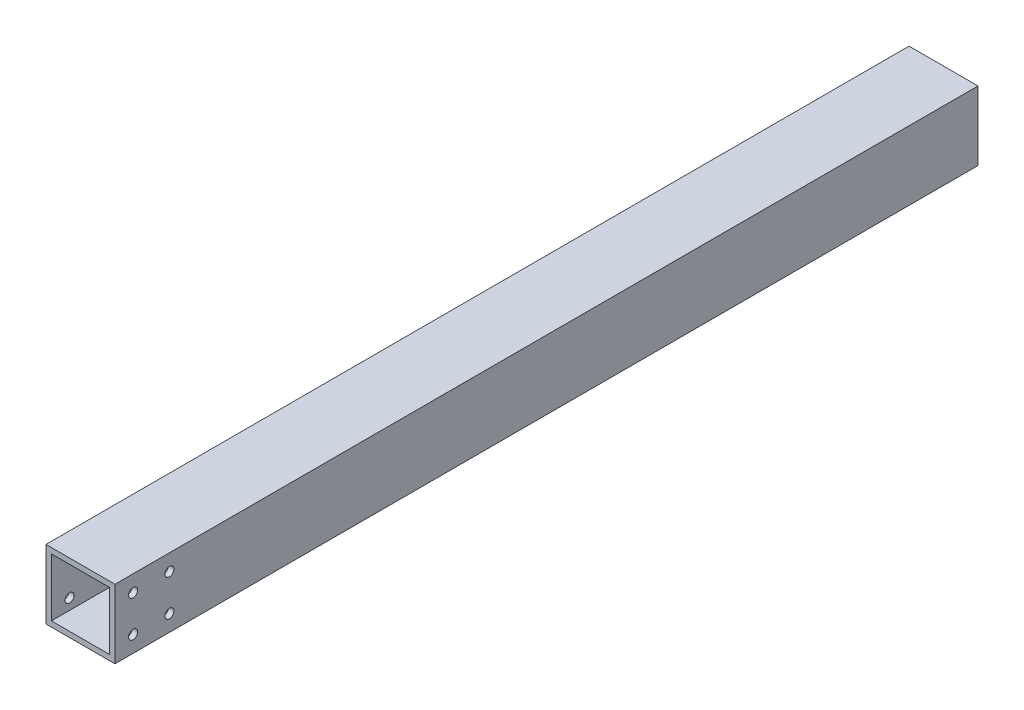
ISO-10303-21;
HEADER;
FILE_DESCRIPTION(('STEP AP214'),'2;1');
FILE_NAME('part.step','',(''),(''),'','','');
FILE_SCHEMA(('AUTOMOTIVE_DESIGN { 1 0 10303 214 1 1 1 1 }'));
ENDSEC;
DATA;
#1=APPLICATION_CONTEXT('core data for automotive mechanical design processes');
#2=APPLICATION_PROTOCOL_DEFINITION('international standard','automotive_design',2000,#1);
#3=PRODUCT_CONTEXT('',#1,'mechanical');
#4=PRODUCT('Part','Part','',(#3));
#5=PRODUCT_RELATED_PRODUCT_CATEGORY('part','',(#4));
#6=PRODUCT_DEFINITION_FORMATION('','',#4);
#7=PRODUCT_DEFINITION_CONTEXT('part definition',#1,'design');
#8=PRODUCT_DEFINITION('design','',#6,#7);
#9=PRODUCT_DEFINITION_SHAPE('','',#8);
#10=(LENGTH_UNIT() NAMED_UNIT(*) SI_UNIT(.MILLI.,.METRE.));
#11=(NAMED_UNIT(*) PLANE_ANGLE_UNIT() SI_UNIT($,.RADIAN.));
#12=(NAMED_UNIT(*) SI_UNIT($,.STERADIAN.) SOLID_ANGLE_UNIT());
#13=UNCERTAINTY_MEASURE_WITH_UNIT(LENGTH_MEASURE(1.E-05),#10,'distance_accuracy_value','');
#14=(GEOMETRIC_REPRESENTATION_CONTEXT(3) GLOBAL_UNCERTAINTY_ASSIGNED_CONTEXT((#13)) GLOBAL_UNIT_ASSIGNED_CONTEXT((#10,
#11,#12)) REPRESENTATION_CONTEXT('',''));
#15=CARTESIAN_POINT('',(0.,0.,0.));
#16=DIRECTION('',(0.,0.,1.));
#17=DIRECTION('',(1.,0.,0.));
#18=AXIS2_PLACEMENT_3D('',#15,#16,#17);
#19=CARTESIAN_POINT('',(0.,0.,475.6));
#20=DIRECTION('',(0.,0.,-1.));
#21=DIRECTION('',(-1.,0.,0.));
#22=AXIS2_PLACEMENT_3D('',#19,#20,#21);
#23=PLANE('',#22);
#24=DIRECTION('',(0.,1.,0.));
#25=VECTOR('',#24,1.);
#26=CARTESIAN_POINT('',(19.,-19.,475.6));
#27=LINE('',#26,#25);
#28=CARTESIAN_POINT('',(19.,-19.,475.6));
#29=VERTEX_POINT('',#28);
#30=CARTESIAN_POINT('',(19.,19.,475.6));
#31=VERTEX_POINT('',#30);
#32=EDGE_CURVE('E148',#29,#31,#27,.T.);
#33=ORIENTED_EDGE('',*,*,#32,.T.);
#34=DIRECTION('',(-1.,0.,0.));
#35=VECTOR('',#34,1.);
#36=CARTESIAN_POINT('',(-19.,19.,475.6));
#37=LINE('',#36,#35);
#38=CARTESIAN_POINT('',(-19.,19.,475.6));
#39=VERTEX_POINT('',#38);
#40=EDGE_CURVE('E151',#31,#39,#37,.T.);
#41=ORIENTED_EDGE('',*,*,#40,.T.);
#42=DIRECTION('',(0.,-1.,0.));
#43=VECTOR('',#42,1.);
#44=CARTESIAN_POINT('',(-19.,-19.,475.6));
#45=LINE('',#44,#43);
#46=CARTESIAN_POINT('',(-19.,-19.,475.6));
#47=VERTEX_POINT('',#46);
#48=EDGE_CURVE('E154',#39,#47,#45,.T.);
#49=ORIENTED_EDGE('',*,*,#48,.T.);
#50=DIRECTION('',(1.,0.,0.));
#51=VECTOR('',#50,1.);
#52=CARTESIAN_POINT('',(-19.,-19.,475.6));
#53=LINE('',#52,#51);
#54=EDGE_CURVE('E156',#47,#29,#53,.T.);
#55=ORIENTED_EDGE('',*,*,#54,.T.);
#56=EDGE_LOOP('',(#33,#41,#49,#55));
#57=FACE_BOUND('',#56,.T.);
#58=DIRECTION('',(0.,-1.,0.));
#59=VECTOR('',#58,1.);
#60=CARTESIAN_POINT('',(-16.,-16.,475.6));
#61=LINE('',#60,#59);
#62=CARTESIAN_POINT('',(-16.,16.,475.6));
#63=VERTEX_POINT('',#62);
#64=CARTESIAN_POINT('',(-16.,-16.,475.6));
#65=VERTEX_POINT('',#64);
#66=EDGE_CURVE('E110',#63,#65,#61,.T.);
#67=ORIENTED_EDGE('',*,*,#66,.F.);
#68=DIRECTION('',(-1.,0.,0.));
#69=VECTOR('',#68,1.);
#70=CARTESIAN_POINT('',(-16.,16.,475.6));
#71=LINE('',#70,#69);
#72=CARTESIAN_POINT('',(16.,16.,475.6));
#73=VERTEX_POINT('',#72);
#74=EDGE_CURVE('E132',#73,#63,#71,.T.);
#75=ORIENTED_EDGE('',*,*,#74,.F.);
#76=DIRECTION('',(0.,1.,0.));
#77=VECTOR('',#76,1.);
#78=CARTESIAN_POINT('',(16.,-16.,475.6));
#79=LINE('',#78,#77);
#80=CARTESIAN_POINT('',(16.,-16.,475.6));
#81=VERTEX_POINT('',#80);
#82=EDGE_CURVE('E130',#81,#73,#79,.T.);
#83=ORIENTED_EDGE('',*,*,#82,.F.);
#84=DIRECTION('',(1.,0.,0.));
#85=VECTOR('',#84,1.);
#86=CARTESIAN_POINT('',(-16.,-16.,475.6));
#87=LINE('',#86,#85);
#88=EDGE_CURVE('E118',#65,#81,#87,.T.);
#89=ORIENTED_EDGE('',*,*,#88,.F.);
#90=EDGE_LOOP('',(#67,#75,#83,#89));
#91=FACE_BOUND('',#90,.T.);
#92=ADVANCED_FACE('F43',(#57,#91),#23,.F.);
#93=CARTESIAN_POINT('',(0.,0.,0.));
#94=DIRECTION('',(0.,0.,-1.));
#95=DIRECTION('',(-1.,0.,0.));
#96=AXIS2_PLACEMENT_3D('',#93,#94,#95);
#97=PLANE('',#96);
#98=DIRECTION('',(0.,1.,0.));
#99=VECTOR('',#98,1.);
#100=CARTESIAN_POINT('',(19.,-19.,0.));
#101=LINE('',#100,#99);
#102=CARTESIAN_POINT('',(19.,-19.,0.));
#103=VERTEX_POINT('',#102);
#104=CARTESIAN_POINT('',(19.,19.,0.));
#105=VERTEX_POINT('',#104);
#106=EDGE_CURVE('E126',#103,#105,#101,.T.);
#107=ORIENTED_EDGE('',*,*,#106,.F.);
#108=DIRECTION('',(1.,0.,0.));
#109=VECTOR('',#108,1.);
#110=CARTESIAN_POINT('',(-19.,-19.,0.));
#111=LINE('',#110,#109);
#112=CARTESIAN_POINT('',(-19.,-19.,0.));
#113=VERTEX_POINT('',#112);
#114=EDGE_CURVE('E152',#113,#103,#111,.T.);
#115=ORIENTED_EDGE('',*,*,#114,.F.);
#116=DIRECTION('',(0.,-1.,0.));
#117=VECTOR('',#116,1.);
#118=CARTESIAN_POINT('',(-19.,-19.,0.));
#119=LINE('',#118,#117);
#120=CARTESIAN_POINT('',(-19.,19.,0.));
#121=VERTEX_POINT('',#120);
#122=EDGE_CURVE('E163',#121,#113,#119,.T.);
#123=ORIENTED_EDGE('',*,*,#122,.F.);
#124=DIRECTION('',(-1.,0.,0.));
#125=VECTOR('',#124,1.);
#126=CARTESIAN_POINT('',(-19.,19.,0.));
#127=LINE('',#126,#125);
#128=EDGE_CURVE('E161',#105,#121,#127,.T.);
#129=ORIENTED_EDGE('',*,*,#128,.F.);
#130=EDGE_LOOP('',(#107,#115,#123,#129));
#131=FACE_BOUND('',#130,.T.);
#132=DIRECTION('',(-1.,0.,0.));
#133=VECTOR('',#132,1.);
#134=CARTESIAN_POINT('',(-16.,16.,0.));
#135=LINE('',#134,#133);
#136=CARTESIAN_POINT('',(16.,16.,0.));
#137=VERTEX_POINT('',#136);
#138=CARTESIAN_POINT('',(-16.,16.,0.));
#139=VERTEX_POINT('',#138);
#140=EDGE_CURVE('E119',#137,#139,#135,.T.);
#141=ORIENTED_EDGE('',*,*,#140,.T.);
#142=DIRECTION('',(0.,-1.,0.));
#143=VECTOR('',#142,1.);
#144=CARTESIAN_POINT('',(-16.,-16.,0.));
#145=LINE('',#144,#143);
#146=CARTESIAN_POINT('',(-16.,-16.,0.));
#147=VERTEX_POINT('',#146);
#148=EDGE_CURVE('E68',#139,#147,#145,.T.);
#149=ORIENTED_EDGE('',*,*,#148,.T.);
#150=DIRECTION('',(1.,0.,0.));
#151=VECTOR('',#150,1.);
#152=CARTESIAN_POINT('',(-16.,-16.,0.));
#153=LINE('',#152,#151);
#154=CARTESIAN_POINT('',(16.,-16.,0.));
#155=VERTEX_POINT('',#154);
#156=EDGE_CURVE('E125',#147,#155,#153,.T.);
#157=ORIENTED_EDGE('',*,*,#156,.T.);
#158=DIRECTION('',(0.,1.,0.));
#159=VECTOR('',#158,1.);
#160=CARTESIAN_POINT('',(16.,-16.,0.));
#161=LINE('',#160,#159);
#162=EDGE_CURVE('E140',#155,#137,#161,.T.);
#163=ORIENTED_EDGE('',*,*,#162,.T.);
#164=EDGE_LOOP('',(#141,#149,#157,#163));
#165=FACE_BOUND('',#164,.T.);
#166=ADVANCED_FACE('F232',(#131,#165),#97,.T.);
#167=CARTESIAN_POINT('',(19.,-19.,475.6));
#168=DIRECTION('',(-1.,0.,0.));
#169=DIRECTION('',(0.,0.,1.));
#170=AXIS2_PLACEMENT_3D('',#167,#168,#169);
#171=PLANE('',#170);
#172=CARTESIAN_POINT('',(19.,10.,445.6));
#173=DIRECTION('',(-1.,0.,0.));
#174=DIRECTION('',(0.,0.,1.));
#175=AXIS2_PLACEMENT_3D('',#172,#173,#174);
#176=CIRCLE('',#175,2.50000000000002);
#177=CARTESIAN_POINT('',(19.,10.,448.1));
#178=VERTEX_POINT('',#177);
#179=EDGE_CURVE('E204',#178,#178,#176,.T.);
#180=ORIENTED_EDGE('',*,*,#179,.T.);
#181=EDGE_LOOP('',(#180));
#182=FACE_BOUND('',#181,.T.);
#183=CARTESIAN_POINT('',(19.,-10.,445.6));
#184=DIRECTION('',(-1.,0.,0.));
#185=DIRECTION('',(0.,0.,1.));
#186=AXIS2_PLACEMENT_3D('',#183,#184,#185);
#187=CIRCLE('',#186,2.50000000000002);
#188=CARTESIAN_POINT('',(19.,-10.,448.1));
#189=VERTEX_POINT('',#188);
#190=EDGE_CURVE('E189',#189,#189,#187,.T.);
#191=ORIENTED_EDGE('',*,*,#190,.T.);
#192=EDGE_LOOP('',(#191));
#193=FACE_BOUND('',#192,.T.);
#194=CARTESIAN_POINT('',(19.,-9.99999999999999,465.6));
#195=DIRECTION('',(-1.,0.,0.));
#196=DIRECTION('',(0.,0.,1.));
#197=AXIS2_PLACEMENT_3D('',#194,#195,#196);
#198=CIRCLE('',#197,2.49999999999991);
#199=CARTESIAN_POINT('',(19.,-9.99999999999999,468.1));
#200=VERTEX_POINT('',#199);
#201=EDGE_CURVE('E185',#200,#200,#198,.T.);
#202=ORIENTED_EDGE('',*,*,#201,.T.);
#203=EDGE_LOOP('',(#202));
#204=FACE_BOUND('',#203,.T.);
#205=CARTESIAN_POINT('',(19.,10.,465.6));
#206=DIRECTION('',(-1.,0.,0.));
#207=DIRECTION('',(0.,0.,1.));
#208=AXIS2_PLACEMENT_3D('',#205,#206,#207);
#209=CIRCLE('',#208,2.49999999999991);
#210=CARTESIAN_POINT('',(19.,10.,468.1));
#211=VERTEX_POINT('',#210);
#212=EDGE_CURVE('E138',#211,#211,#209,.T.);
#213=ORIENTED_EDGE('',*,*,#212,.T.);
#214=EDGE_LOOP('',(#213));
#215=FACE_BOUND('',#214,.T.);
#216=ORIENTED_EDGE('',*,*,#106,.T.);
#217=DIRECTION('',(0.,0.,-1.));
#218=VECTOR('',#217,1.);
#219=CARTESIAN_POINT('',(19.,19.,475.6));
#220=LINE('',#219,#218);
#221=EDGE_CURVE('E11',#31,#105,#220,.T.);
#222=ORIENTED_EDGE('',*,*,#221,.F.);
#223=ORIENTED_EDGE('',*,*,#32,.F.);
#224=DIRECTION('',(0.,0.,-1.));
#225=VECTOR('',#224,1.);
#226=CARTESIAN_POINT('',(19.,-19.,475.6));
#227=LINE('',#226,#225);
#228=EDGE_CURVE('E158',#29,#103,#227,.T.);
#229=ORIENTED_EDGE('',*,*,#228,.T.);
#230=EDGE_LOOP('',(#216,#222,#223,#229));
#231=FACE_BOUND('',#230,.T.);
#232=ADVANCED_FACE('F45',(#182,#193,#204,#215,#231),#171,.F.);
#233=CARTESIAN_POINT('',(-19.,19.,475.6));
#234=DIRECTION('',(0.,-1.,0.));
#235=DIRECTION('',(1.,0.,0.));
#236=AXIS2_PLACEMENT_3D('',#233,#234,#235);
#237=PLANE('',#236);
#238=ORIENTED_EDGE('',*,*,#128,.T.);
#239=DIRECTION('',(0.,0.,-1.));
#240=VECTOR('',#239,1.);
#241=CARTESIAN_POINT('',(-19.,19.,475.6));
#242=LINE('',#241,#240);
#243=EDGE_CURVE('E52',#39,#121,#242,.T.);
#244=ORIENTED_EDGE('',*,*,#243,.F.);
#245=ORIENTED_EDGE('',*,*,#40,.F.);
#246=ORIENTED_EDGE('',*,*,#221,.T.);
#247=EDGE_LOOP('',(#238,#244,#245,#246));
#248=FACE_BOUND('',#247,.T.);
#249=ADVANCED_FACE('F249',(#248),#237,.F.);
#250=CARTESIAN_POINT('',(-19.,-19.,475.6));
#251=DIRECTION('',(1.,0.,0.));
#252=DIRECTION('',(0.,0.,-1.));
#253=AXIS2_PLACEMENT_3D('',#250,#251,#252);
#254=PLANE('',#253);
#255=CARTESIAN_POINT('',(-19.,10.,445.6));
#256=DIRECTION('',(1.,0.,0.));
#257=DIRECTION('',(0.,0.,-1.));
#258=AXIS2_PLACEMENT_3D('',#255,#256,#257);
#259=CIRCLE('',#258,2.50000000000002);
#260=CARTESIAN_POINT('',(-19.,10.,443.1));
#261=VERTEX_POINT('',#260);
#262=EDGE_CURVE('E181',#261,#261,#259,.T.);
#263=ORIENTED_EDGE('',*,*,#262,.T.);
#264=EDGE_LOOP('',(#263));
#265=FACE_BOUND('',#264,.T.);
#266=CARTESIAN_POINT('',(-19.,-10.,445.6));
#267=DIRECTION('',(1.,0.,0.));
#268=DIRECTION('',(0.,0.,-1.));
#269=AXIS2_PLACEMENT_3D('',#266,#267,#268);
#270=CIRCLE('',#269,2.50000000000002);
#271=CARTESIAN_POINT('',(-19.,-10.,443.1));
#272=VERTEX_POINT('',#271);
#273=EDGE_CURVE('E311',#272,#272,#270,.T.);
#274=ORIENTED_EDGE('',*,*,#273,.T.);
#275=EDGE_LOOP('',(#274));
#276=FACE_BOUND('',#275,.T.);
#277=CARTESIAN_POINT('',(-19.,-9.99999999999999,465.6));
#278=DIRECTION('',(1.,0.,0.));
#279=DIRECTION('',(0.,0.,-1.));
#280=AXIS2_PLACEMENT_3D('',#277,#278,#279);
#281=CIRCLE('',#280,2.49999999999991);
#282=CARTESIAN_POINT('',(-19.,-9.99999999999999,463.1));
#283=VERTEX_POINT('',#282);
#284=EDGE_CURVE('E309',#283,#283,#281,.T.);
#285=ORIENTED_EDGE('',*,*,#284,.T.);
#286=EDGE_LOOP('',(#285));
#287=FACE_BOUND('',#286,.T.);
#288=CARTESIAN_POINT('',(-19.,10.,465.6));
#289=DIRECTION('',(1.,0.,0.));
#290=DIRECTION('',(0.,0.,-1.));
#291=AXIS2_PLACEMENT_3D('',#288,#289,#290);
#292=CIRCLE('',#291,2.49999999999991);
#293=CARTESIAN_POINT('',(-19.,10.,463.1));
#294=VERTEX_POINT('',#293);
#295=EDGE_CURVE('E177',#294,#294,#292,.T.);
#296=ORIENTED_EDGE('',*,*,#295,.T.);
#297=EDGE_LOOP('',(#296));
#298=FACE_BOUND('',#297,.T.);
#299=ORIENTED_EDGE('',*,*,#122,.T.);
#300=DIRECTION('',(0.,0.,-1.));
#301=VECTOR('',#300,1.);
#302=CARTESIAN_POINT('',(-19.,-19.,475.6));
#303=LINE('',#302,#301);
#304=EDGE_CURVE('E168',#47,#113,#303,.T.);
#305=ORIENTED_EDGE('',*,*,#304,.F.);
#306=ORIENTED_EDGE('',*,*,#48,.F.);
#307=ORIENTED_EDGE('',*,*,#243,.T.);
#308=EDGE_LOOP('',(#299,#305,#306,#307));
#309=FACE_BOUND('',#308,.T.);
#310=ADVANCED_FACE('F246',(#265,#276,#287,#298,#309),#254,.F.);
#311=CARTESIAN_POINT('',(-19.,-19.,475.6));
#312=DIRECTION('',(0.,1.,0.));
#313=DIRECTION('',(0.,0.,1.));
#314=AXIS2_PLACEMENT_3D('',#311,#312,#313);
#315=PLANE('',#314);
#316=ORIENTED_EDGE('',*,*,#114,.T.);
#317=ORIENTED_EDGE('',*,*,#228,.F.);
#318=ORIENTED_EDGE('',*,*,#54,.F.);
#319=ORIENTED_EDGE('',*,*,#304,.T.);
#320=EDGE_LOOP('',(#316,#317,#318,#319));
#321=FACE_BOUND('',#320,.T.);
#322=ADVANCED_FACE('F243',(#321),#315,.F.);
#323=CARTESIAN_POINT('',(-16.,-16.,475.6));
#324=DIRECTION('',(1.,0.,0.));
#325=DIRECTION('',(0.,1.,0.));
#326=AXIS2_PLACEMENT_3D('',#323,#324,#325);
#327=PLANE('',#326);
#328=CARTESIAN_POINT('',(-16.,10.,445.6));
#329=DIRECTION('',(1.,0.,0.));
#330=DIRECTION('',(0.,1.,0.));
#331=AXIS2_PLACEMENT_3D('',#328,#329,#330);
#332=CIRCLE('',#331,2.50000000000002);
#333=CARTESIAN_POINT('',(-16.,12.5,445.6));
#334=VERTEX_POINT('',#333);
#335=EDGE_CURVE('E201',#334,#334,#332,.T.);
#336=ORIENTED_EDGE('',*,*,#335,.F.);
#337=EDGE_LOOP('',(#336));
#338=FACE_BOUND('',#337,.T.);
#339=CARTESIAN_POINT('',(-16.,-10.,445.6));
#340=DIRECTION('',(1.,0.,0.));
#341=DIRECTION('',(0.,1.,0.));
#342=AXIS2_PLACEMENT_3D('',#339,#340,#341);
#343=CIRCLE('',#342,2.50000000000002);
#344=CARTESIAN_POINT('',(-16.,-7.49999999999998,445.6));
#345=VERTEX_POINT('',#344);
#346=EDGE_CURVE('E184',#345,#345,#343,.T.);
#347=ORIENTED_EDGE('',*,*,#346,.F.);
#348=EDGE_LOOP('',(#347));
#349=FACE_BOUND('',#348,.T.);
#350=CARTESIAN_POINT('',(-16.,-9.99999999999999,465.6));
#351=DIRECTION('',(1.,0.,0.));
#352=DIRECTION('',(0.,1.,0.));
#353=AXIS2_PLACEMENT_3D('',#350,#351,#352);
#354=CIRCLE('',#353,2.49999999999991);
#355=CARTESIAN_POINT('',(-16.,-7.50000000000009,465.6));
#356=VERTEX_POINT('',#355);
#357=EDGE_CURVE('E180',#356,#356,#354,.T.);
#358=ORIENTED_EDGE('',*,*,#357,.F.);
#359=EDGE_LOOP('',(#358));
#360=FACE_BOUND('',#359,.T.);
#361=CARTESIAN_POINT('',(-16.,10.,465.6));
#362=DIRECTION('',(1.,0.,0.));
#363=DIRECTION('',(0.,1.,0.));
#364=AXIS2_PLACEMENT_3D('',#361,#362,#363);
#365=CIRCLE('',#364,2.49999999999991);
#366=CARTESIAN_POINT('',(-16.,12.4999999999999,465.6));
#367=VERTEX_POINT('',#366);
#368=EDGE_CURVE('E176',#367,#367,#365,.T.);
#369=ORIENTED_EDGE('',*,*,#368,.F.);
#370=EDGE_LOOP('',(#369));
#371=FACE_BOUND('',#370,.T.);
#372=ORIENTED_EDGE('',*,*,#148,.F.);
#373=DIRECTION('',(0.,0.,-1.));
#374=VECTOR('',#373,1.);
#375=CARTESIAN_POINT('',(-16.,16.,475.6));
#376=LINE('',#375,#374);
#377=EDGE_CURVE('E114',#63,#139,#376,.T.);
#378=ORIENTED_EDGE('',*,*,#377,.F.);
#379=ORIENTED_EDGE('',*,*,#66,.T.);
#380=DIRECTION('',(0.,0.,-1.));
#381=VECTOR('',#380,1.);
#382=CARTESIAN_POINT('',(-16.,-16.,475.6));
#383=LINE('',#382,#381);
#384=EDGE_CURVE('E113',#65,#147,#383,.T.);
#385=ORIENTED_EDGE('',*,*,#384,.T.);
#386=EDGE_LOOP('',(#372,#378,#379,#385));
#387=FACE_BOUND('',#386,.T.);
#388=ADVANCED_FACE('F112',(#338,#349,#360,#371,#387),#327,.T.);
#389=CARTESIAN_POINT('',(-16.,-16.,475.6));
#390=DIRECTION('',(0.,1.,0.));
#391=DIRECTION('',(-1.,0.,0.));
#392=AXIS2_PLACEMENT_3D('',#389,#390,#391);
#393=PLANE('',#392);
#394=ORIENTED_EDGE('',*,*,#156,.F.);
#395=ORIENTED_EDGE('',*,*,#384,.F.);
#396=ORIENTED_EDGE('',*,*,#88,.T.);
#397=DIRECTION('',(0.,0.,-1.));
#398=VECTOR('',#397,1.);
#399=CARTESIAN_POINT('',(16.,-16.,475.6));
#400=LINE('',#399,#398);
#401=EDGE_CURVE('E127',#81,#155,#400,.T.);
#402=ORIENTED_EDGE('',*,*,#401,.T.);
#403=EDGE_LOOP('',(#394,#395,#396,#402));
#404=FACE_BOUND('',#403,.T.);
#405=ADVANCED_FACE('F122',(#404),#393,.T.);
#406=CARTESIAN_POINT('',(16.,-16.,475.6));
#407=DIRECTION('',(-1.,0.,0.));
#408=DIRECTION('',(0.,-1.,0.));
#409=AXIS2_PLACEMENT_3D('',#406,#407,#408);
#410=PLANE('',#409);
#411=CARTESIAN_POINT('',(16.,10.,445.6));
#412=DIRECTION('',(-1.,0.,0.));
#413=DIRECTION('',(0.,-1.,0.));
#414=AXIS2_PLACEMENT_3D('',#411,#412,#413);
#415=CIRCLE('',#414,2.50000000000002);
#416=CARTESIAN_POINT('',(16.,7.49999999999998,445.6));
#417=VERTEX_POINT('',#416);
#418=EDGE_CURVE('E47',#417,#417,#415,.T.);
#419=ORIENTED_EDGE('',*,*,#418,.F.);
#420=EDGE_LOOP('',(#419));
#421=FACE_BOUND('',#420,.T.);
#422=CARTESIAN_POINT('',(16.,-10.,445.6));
#423=DIRECTION('',(-1.,0.,0.));
#424=DIRECTION('',(0.,-1.,0.));
#425=AXIS2_PLACEMENT_3D('',#422,#423,#424);
#426=CIRCLE('',#425,2.50000000000002);
#427=CARTESIAN_POINT('',(16.,-12.5,445.6));
#428=VERTEX_POINT('',#427);
#429=EDGE_CURVE('E182',#428,#428,#426,.T.);
#430=ORIENTED_EDGE('',*,*,#429,.F.);
#431=EDGE_LOOP('',(#430));
#432=FACE_BOUND('',#431,.T.);
#433=CARTESIAN_POINT('',(16.,-9.99999999999999,465.6));
#434=DIRECTION('',(-1.,0.,0.));
#435=DIRECTION('',(0.,-1.,0.));
#436=AXIS2_PLACEMENT_3D('',#433,#434,#435);
#437=CIRCLE('',#436,2.49999999999991);
#438=CARTESIAN_POINT('',(16.,-12.4999999999999,465.6));
#439=VERTEX_POINT('',#438);
#440=EDGE_CURVE('E178',#439,#439,#437,.T.);
#441=ORIENTED_EDGE('',*,*,#440,.F.);
#442=EDGE_LOOP('',(#441));
#443=FACE_BOUND('',#442,.T.);
#444=CARTESIAN_POINT('',(16.,10.,465.6));
#445=DIRECTION('',(-1.,0.,0.));
#446=DIRECTION('',(0.,-1.,0.));
#447=AXIS2_PLACEMENT_3D('',#444,#445,#446);
#448=CIRCLE('',#447,2.49999999999991);
#449=CARTESIAN_POINT('',(16.,7.50000000000009,465.6));
#450=VERTEX_POINT('',#449);
#451=EDGE_CURVE('E173',#450,#450,#448,.T.);
#452=ORIENTED_EDGE('',*,*,#451,.F.);
#453=EDGE_LOOP('',(#452));
#454=FACE_BOUND('',#453,.T.);
#455=ORIENTED_EDGE('',*,*,#162,.F.);
#456=ORIENTED_EDGE('',*,*,#401,.F.);
#457=ORIENTED_EDGE('',*,*,#82,.T.);
#458=DIRECTION('',(0.,0.,-1.));
#459=VECTOR('',#458,1.);
#460=CARTESIAN_POINT('',(16.,16.,475.6));
#461=LINE('',#460,#459);
#462=EDGE_CURVE('E60',#73,#137,#461,.T.);
#463=ORIENTED_EDGE('',*,*,#462,.T.);
#464=EDGE_LOOP('',(#455,#456,#457,#463));
#465=FACE_BOUND('',#464,.T.);
#466=ADVANCED_FACE('F228',(#421,#432,#443,#454,#465),#410,.T.);
#467=CARTESIAN_POINT('',(-16.,16.,475.6));
#468=DIRECTION('',(0.,-1.,0.));
#469=DIRECTION('',(1.,0.,0.));
#470=AXIS2_PLACEMENT_3D('',#467,#468,#469);
#471=PLANE('',#470);
#472=ORIENTED_EDGE('',*,*,#140,.F.);
#473=ORIENTED_EDGE('',*,*,#462,.F.);
#474=ORIENTED_EDGE('',*,*,#74,.T.);
#475=ORIENTED_EDGE('',*,*,#377,.T.);
#476=EDGE_LOOP('',(#472,#473,#474,#475));
#477=FACE_BOUND('',#476,.T.);
#478=ADVANCED_FACE('F218',(#477),#471,.T.);
#479=CARTESIAN_POINT('',(-19.,10.,465.6));
#480=DIRECTION('',(1.,0.,0.));
#481=DIRECTION('',(0.,0.,-1.));
#482=AXIS2_PLACEMENT_3D('',#479,#480,#481);
#483=CYLINDRICAL_SURFACE('',#482,2.49999999999991);
#484=ORIENTED_EDGE('',*,*,#451,.T.);
#485=EDGE_LOOP('',(#484));
#486=FACE_BOUND('',#485,.T.);
#487=ORIENTED_EDGE('',*,*,#212,.F.);
#488=EDGE_LOOP('',(#487));
#489=FACE_BOUND('',#488,.T.);
#490=ADVANCED_FACE('F215',(#486,#489),#483,.F.);
#491=ORIENTED_EDGE('',*,*,#368,.T.);
#492=EDGE_LOOP('',(#491));
#493=FACE_BOUND('',#492,.T.);
#494=ORIENTED_EDGE('',*,*,#295,.F.);
#495=EDGE_LOOP('',(#494));
#496=FACE_BOUND('',#495,.T.);
#497=ADVANCED_FACE('F217',(#493,#496),#483,.F.);
#498=CARTESIAN_POINT('',(-19.,-9.99999999999999,465.6));
#499=DIRECTION('',(1.,0.,0.));
#500=DIRECTION('',(0.,0.,-1.));
#501=AXIS2_PLACEMENT_3D('',#498,#499,#500);
#502=CYLINDRICAL_SURFACE('',#501,2.49999999999991);
#503=ORIENTED_EDGE('',*,*,#440,.T.);
#504=EDGE_LOOP('',(#503));
#505=FACE_BOUND('',#504,.T.);
#506=ORIENTED_EDGE('',*,*,#201,.F.);
#507=EDGE_LOOP('',(#506));
#508=FACE_BOUND('',#507,.T.);
#509=ADVANCED_FACE('F225',(#505,#508),#502,.F.);
#510=CARTESIAN_POINT('',(-19.,-10.,445.6));
#511=DIRECTION('',(1.,0.,0.));
#512=DIRECTION('',(0.,0.,-1.));
#513=AXIS2_PLACEMENT_3D('',#510,#511,#512);
#514=CYLINDRICAL_SURFACE('',#513,2.50000000000002);
#515=ORIENTED_EDGE('',*,*,#429,.T.);
#516=EDGE_LOOP('',(#515));
#517=FACE_BOUND('',#516,.T.);
#518=ORIENTED_EDGE('',*,*,#190,.F.);
#519=EDGE_LOOP('',(#518));
#520=FACE_BOUND('',#519,.T.);
#521=ADVANCED_FACE('F287',(#517,#520),#514,.F.);
#522=CARTESIAN_POINT('',(-19.,10.,445.6));
#523=DIRECTION('',(1.,0.,0.));
#524=DIRECTION('',(0.,0.,-1.));
#525=AXIS2_PLACEMENT_3D('',#522,#523,#524);
#526=CYLINDRICAL_SURFACE('',#525,2.50000000000002);
#527=ORIENTED_EDGE('',*,*,#418,.T.);
#528=EDGE_LOOP('',(#527));
#529=FACE_BOUND('',#528,.T.);
#530=ORIENTED_EDGE('',*,*,#179,.F.);
#531=EDGE_LOOP('',(#530));
#532=FACE_BOUND('',#531,.T.);
#533=ADVANCED_FACE('F292',(#529,#532),#526,.F.);
#534=ORIENTED_EDGE('',*,*,#357,.T.);
#535=EDGE_LOOP('',(#534));
#536=FACE_BOUND('',#535,.T.);
#537=ORIENTED_EDGE('',*,*,#284,.F.);
#538=EDGE_LOOP('',(#537));
#539=FACE_BOUND('',#538,.T.);
#540=ADVANCED_FACE('F288',(#536,#539),#502,.F.);
#541=ORIENTED_EDGE('',*,*,#346,.T.);
#542=EDGE_LOOP('',(#541));
#543=FACE_BOUND('',#542,.T.);
#544=ORIENTED_EDGE('',*,*,#273,.F.);
#545=EDGE_LOOP('',(#544));
#546=FACE_BOUND('',#545,.T.);
#547=ADVANCED_FACE('F294',(#543,#546),#514,.F.);
#548=ORIENTED_EDGE('',*,*,#335,.T.);
#549=EDGE_LOOP('',(#548));
#550=FACE_BOUND('',#549,.T.);
#551=ORIENTED_EDGE('',*,*,#262,.F.);
#552=EDGE_LOOP('',(#551));
#553=FACE_BOUND('',#552,.T.);
#554=ADVANCED_FACE('F301',(#550,#553),#526,.F.);
#555=CLOSED_SHELL('',(#92,#166,#232,#249,#310,#322,#388,#405,#466,#478,#490,#497,#509,#521,#533,
#540,#547,#554));
#556=MANIFOLD_SOLID_BREP('B2',#555);
#557=ADVANCED_BREP_SHAPE_REPRESENTATION('',(#18,#556),#14);
#558=SHAPE_DEFINITION_REPRESENTATION(#9,#557);
ENDSEC;
END-ISO-10303-21;
